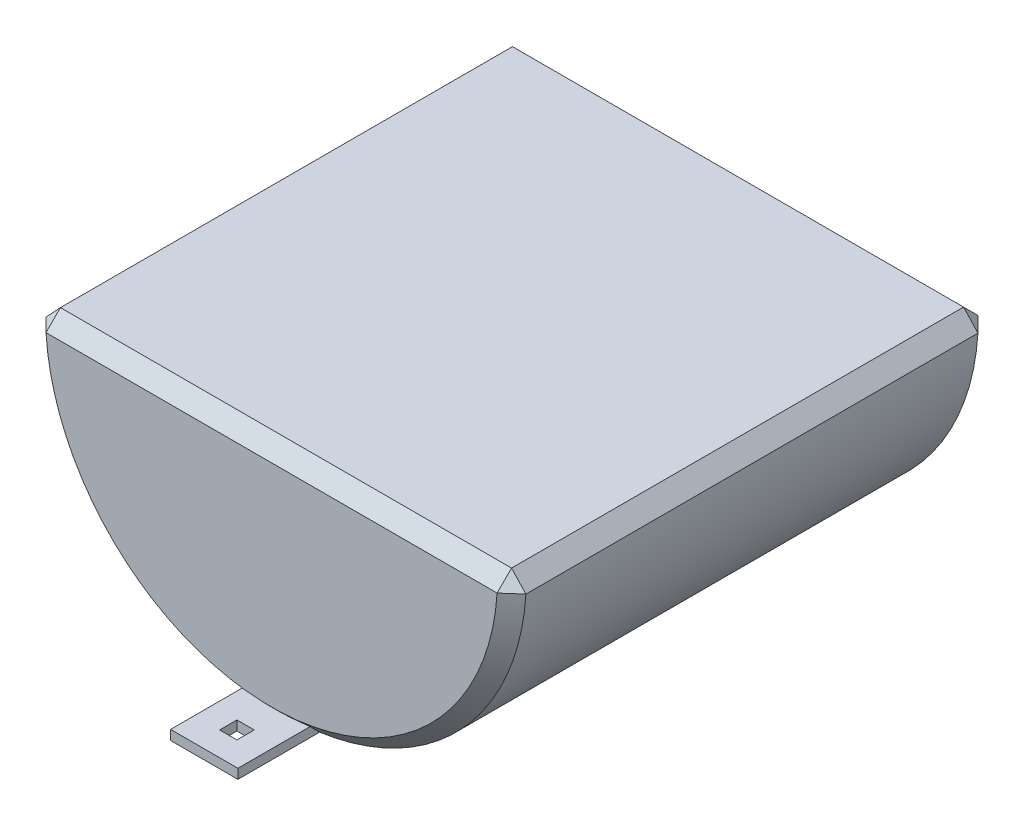
ISO-10303-21;
HEADER;
FILE_DESCRIPTION(('STEP AP214'),'2;1');
FILE_NAME('part.step','',(''),(''),'','','');
FILE_SCHEMA(('AUTOMOTIVE_DESIGN { 1 0 10303 214 1 1 1 1 }'));
ENDSEC;
DATA;
#1=APPLICATION_CONTEXT('core data for automotive mechanical design processes');
#2=APPLICATION_PROTOCOL_DEFINITION('international standard','automotive_design',2000,#1);
#3=PRODUCT_CONTEXT('',#1,'mechanical');
#4=PRODUCT('Part','Part','',(#3));
#5=PRODUCT_RELATED_PRODUCT_CATEGORY('part','',(#4));
#6=PRODUCT_DEFINITION_FORMATION('','',#4);
#7=PRODUCT_DEFINITION_CONTEXT('part definition',#1,'design');
#8=PRODUCT_DEFINITION('design','',#6,#7);
#9=PRODUCT_DEFINITION_SHAPE('','',#8);
#10=(LENGTH_UNIT() NAMED_UNIT(*) SI_UNIT(.MILLI.,.METRE.));
#11=(NAMED_UNIT(*) PLANE_ANGLE_UNIT() SI_UNIT($,.RADIAN.));
#12=(NAMED_UNIT(*) SI_UNIT($,.STERADIAN.) SOLID_ANGLE_UNIT());
#13=UNCERTAINTY_MEASURE_WITH_UNIT(LENGTH_MEASURE(1.E-05),#10,'distance_accuracy_value','');
#14=(GEOMETRIC_REPRESENTATION_CONTEXT(3) GLOBAL_UNCERTAINTY_ASSIGNED_CONTEXT((#13)) GLOBAL_UNIT_ASSIGNED_CONTEXT((#10,
#11,#12)) REPRESENTATION_CONTEXT('',''));
#15=CARTESIAN_POINT('',(0.,0.,0.));
#16=DIRECTION('',(0.,0.,1.));
#17=DIRECTION('',(1.,0.,0.));
#18=AXIS2_PLACEMENT_3D('',#15,#16,#17);
#19=CARTESIAN_POINT('',(25.,25.,50.));
#20=DIRECTION('',(0.,0.,-1.));
#21=DIRECTION('',(-1.,0.,0.));
#22=AXIS2_PLACEMENT_3D('',#19,#20,#21);
#23=CONICAL_SURFACE('',#22,23.5,0.785398163397452);
#24=CARTESIAN_POINT('',(21.5,2.94269200632307,51.1667325290739));
#25=CARTESIAN_POINT('',(21.5,2.52969256143822,50.7588335212439));
#26=CARTESIAN_POINT('',(21.5,2.11683100339902,50.3507949498407));
#27=CARTESIAN_POINT('',(21.5,1.29134808227903,49.5344751229693));
#28=CARTESIAN_POINT('',(21.5,0.878726719135952,49.1261938675641));
#29=CARTESIAN_POINT('',(21.5,0.0536884240672885,48.3094249330408));
#30=CARTESIAN_POINT('',(21.5,-0.358728507872784,47.9009372539373));
#31=CARTESIAN_POINT('',(21.5,-1.18338449852477,47.0837821723302));
#32=CARTESIAN_POINT('',(21.5,-1.5956235571906,46.6751147697802));
#33=CARTESIAN_POINT('',(21.5,-2.00778683680805,46.2663709758971));
#34=B_SPLINE_CURVE_WITH_KNOTS('',3,(#24,#25,#26,#27,#28,#29,#30,#31,#32,#33),.UNSPECIFIED.,.F.,
.F.,(4,2,2,2,4),(0.,1.74142211894048,3.48284378613279,5.22426532993233,6.96568732463627),.UNSPECIFIED.);
#35=CARTESIAN_POINT('',(21.5,1.24621241102687,49.4897433411874));
#36=VERTEX_POINT('',#35);
#37=CARTESIAN_POINT('',(21.5,0.246212411026864,48.5));
#38=VERTEX_POINT('',#37);
#39=EDGE_CURVE('E11',#36,#38,#34,.T.);
#40=ORIENTED_EDGE('',*,*,#39,.F.);
#41=CARTESIAN_POINT('',(13.0308933330387,1.24621241102687,46.9010913903004));
#42=CARTESIAN_POINT('',(13.401458624964,1.24621241102687,47.0678288544283));
#43=CARTESIAN_POINT('',(13.7743252882683,1.24621241102687,47.2294491204987));
#44=CARTESIAN_POINT('',(14.5249023020002,1.24621241102687,47.5413136423069));
#45=CARTESIAN_POINT('',(14.9026139799392,1.24621241102687,47.6915546988244));
#46=CARTESIAN_POINT('',(16.0450219330295,1.24621241102687,48.1241003478931));
#47=CARTESIAN_POINT('',(16.8170842701124,1.24621241102687,48.3873563626032));
#48=CARTESIAN_POINT('',(18.3728672231256,1.24621241102687,48.8501359501833));
#49=CARTESIAN_POINT('',(19.1564204359001,1.24621241102687,49.05021165646));
#50=CARTESIAN_POINT('',(20.3423091295269,1.24621241102687,49.2969655587769));
#51=CARTESIAN_POINT('',(20.7391880572026,1.24621241102687,49.3703030135917));
#52=CARTESIAN_POINT('',(21.5359463897745,1.24621241102687,49.4981766790939));
#53=CARTESIAN_POINT('',(21.9358255488293,1.24621241102687,49.5527144134194));
#54=CARTESIAN_POINT('',(22.9245031294916,1.24621241102687,49.6628552612914));
#55=CARTESIAN_POINT('',(23.5146074758049,1.24621241102687,49.707140288255));
#56=CARTESIAN_POINT('',(24.6965365463653,1.24621241102687,49.7516175637132));
#57=CARTESIAN_POINT('',(25.2883614722613,1.24621241102687,49.7518044169544));
#58=CARTESIAN_POINT('',(26.4714711521758,1.24621241102687,49.7080366765752));
#59=CARTESIAN_POINT('',(27.0627528275719,1.24621241102687,49.6639995546551));
#60=CARTESIAN_POINT('',(28.2404836497035,1.24621241102687,49.5333434435275));
#61=CARTESIAN_POINT('',(28.8269333623517,1.24621241102687,49.4467295150584));
#62=CARTESIAN_POINT('',(29.8658456650485,1.24621241102687,49.2571140135586));
#63=CARTESIAN_POINT('',(30.3197303568505,1.24621241102687,49.1617640215412));
#64=CARTESIAN_POINT('',(31.2222386632148,1.24621241102687,48.9486997959963));
#65=CARTESIAN_POINT('',(31.6708615649582,1.24621241102687,48.8309825686813));
#66=CARTESIAN_POINT('',(33.0092044481385,1.24621241102687,48.4468799365095));
#67=CARTESIAN_POINT('',(33.8902414668686,1.24621241102687,48.1497638941563));
#68=CARTESIAN_POINT('',(35.1931327969802,1.24621241102687,47.6546829406354));
#69=CARTESIAN_POINT('',(35.6246778873749,1.24621241102687,47.4812530711538));
#70=CARTESIAN_POINT('',(36.4816533648986,1.24621241102687,47.1197051366759));
#71=CARTESIAN_POINT('',(36.907083245347,1.24621241102687,46.9315858627897));
#72=CARTESIAN_POINT('',(37.7503122889009,1.24621241102687,46.5431224255061));
#73=CARTESIAN_POINT('',(38.1681344315218,1.24621241102687,46.3428278256129));
#74=CARTESIAN_POINT('',(38.9979898943832,1.24621241102687,45.9308712770064));
#75=CARTESIAN_POINT('',(39.4100248918529,1.24621241102687,45.719212711294));
#76=CARTESIAN_POINT('',(39.819379179539,1.24621241102687,45.5025639729456));
#77=B_SPLINE_CURVE_WITH_KNOTS('',3,(#41,#42,#43,#44,#45,#46,#47,#48,#49,#50,#51,#52,#53,#54,#55,
#56,#57,#58,#59,#60,#61,#62,#63,#64,#65,#66,#67,#68,#69,#70,#71,#72,#73,#74,#75,#76),
.UNSPECIFIED.,.F.,.F.,(4,2,2,2,2,2,2,2,2,2,2,2,2,2,2,2,2,4),(0.,1.21898873462397,
2.43831892070092,4.88325681248539,7.30619585118697,8.51659965829408,9.72690534419579,
11.5005164145858,13.2743444798141,15.0514889260364,16.8284221894509,18.2192049111912,
19.6101739163421,22.395631723907,23.7907331730833,25.1859495558034,26.5758240286496,
27.9652870119271),.UNSPECIFIED.);
#78=CARTESIAN_POINT('',(28.5,1.24621241102687,49.4897433411874));
#79=VERTEX_POINT('',#78);
#80=EDGE_CURVE('E47',#79,#36,#77,.F.);
#81=ORIENTED_EDGE('',*,*,#80,.F.);
#82=CARTESIAN_POINT('',(28.5,-2.00778683680805,46.2663709758971));
#83=CARTESIAN_POINT('',(28.5,-1.5956235571906,46.6751147697802));
#84=CARTESIAN_POINT('',(28.5,-1.18338449852477,47.0837821723302));
#85=CARTESIAN_POINT('',(28.5,-0.358728507872784,47.9009372539372));
#86=CARTESIAN_POINT('',(28.5,0.0536884240672884,48.3094249330408));
#87=CARTESIAN_POINT('',(28.5,0.878726719135952,49.1261938675641));
#88=CARTESIAN_POINT('',(28.5,1.29134808227903,49.5344751229693));
#89=CARTESIAN_POINT('',(28.5,2.11683100339902,50.3507949498407));
#90=CARTESIAN_POINT('',(28.5,2.52969256143822,50.7588335212439));
#91=CARTESIAN_POINT('',(28.5,2.94269200632307,51.1667325290739));
#92=B_SPLINE_CURVE_WITH_KNOTS('',3,(#82,#83,#84,#85,#86,#87,#88,#89,#90,#91),.UNSPECIFIED.,.F.,
.F.,(4,2,2,2,4),(0.,1.74142199470394,3.48284353850347,5.22426520569579,6.96568732463627),.UNSPECIFIED.);
#93=CARTESIAN_POINT('',(28.5,0.246212411026871,48.5));
#94=VERTEX_POINT('',#93);
#95=EDGE_CURVE('E264',#94,#79,#92,.T.);
#96=ORIENTED_EDGE('',*,*,#95,.F.);
#97=CARTESIAN_POINT('',(25.,25.,48.5));
#98=DIRECTION('',(0.,0.,1.));
#99=DIRECTION('',(1.,0.,0.));
#100=AXIS2_PLACEMENT_3D('',#97,#98,#99);
#101=CIRCLE('',#100,25.);
#102=CARTESIAN_POINT('',(49.9490199990608,23.404255319149,48.5));
#103=VERTEX_POINT('',#102);
#104=EDGE_CURVE('E221',#103,#94,#101,.F.);
#105=ORIENTED_EDGE('',*,*,#104,.F.);
#106=DIRECTION('',(0.70566484901179,-0.0451344753948861,-0.707106781186545));
#107=VECTOR('',#106,1.);
#108=CARTESIAN_POINT('',(25.,25.,73.4999999999998));
#109=LINE('',#108,#107);
#110=CARTESIAN_POINT('',(48.4520787991172,23.5,50.));
#111=VERTEX_POINT('',#110);
#112=EDGE_CURVE('E199',#111,#103,#109,.T.);
#113=ORIENTED_EDGE('',*,*,#112,.F.);
#114=CARTESIAN_POINT('',(25.,25.,50.));
#115=DIRECTION('',(0.,0.,1.));
#116=DIRECTION('',(1.,0.,0.));
#117=AXIS2_PLACEMENT_3D('',#114,#115,#116);
#118=CIRCLE('',#117,23.5);
#119=CARTESIAN_POINT('',(1.54792120088284,23.5,50.));
#120=VERTEX_POINT('',#119);
#121=EDGE_CURVE('E211',#120,#111,#118,.T.);
#122=ORIENTED_EDGE('',*,*,#121,.F.);
#123=DIRECTION('',(0.705664849011789,0.0451344753948857,0.707106781186545));
#124=VECTOR('',#123,1.);
#125=CARTESIAN_POINT('',(25.,25.,73.4999999999998));
#126=LINE('',#125,#124);
#127=CARTESIAN_POINT('',(0.0509800009392017,23.4042553191489,48.5));
#128=VERTEX_POINT('',#127);
#129=EDGE_CURVE('E248',#128,#120,#126,.T.);
#130=ORIENTED_EDGE('',*,*,#129,.F.);
#131=EDGE_CURVE('E220',#38,#128,#101,.F.);
#132=ORIENTED_EDGE('',*,*,#131,.F.);
#133=EDGE_LOOP('',(#40,#81,#96,#105,#113,#122,#130,#132));
#134=FACE_BOUND('',#133,.T.);
#135=ADVANCED_FACE('F35',(#134),#23,.T.);
#136=CARTESIAN_POINT('',(25.,25.,50.));
#137=DIRECTION('',(0.,0.,-1.));
#138=DIRECTION('',(-1.,0.,0.));
#139=AXIS2_PLACEMENT_3D('',#136,#137,#138);
#140=CYLINDRICAL_SURFACE('',#139,25.);
#141=ORIENTED_EDGE('',*,*,#104,.T.);
#142=EDGE_CURVE('E224',#94,#38,#101,.F.);
#143=ORIENTED_EDGE('',*,*,#142,.T.);
#144=ORIENTED_EDGE('',*,*,#131,.T.);
#145=DIRECTION('',(0.,0.,-1.));
#146=VECTOR('',#145,1.);
#147=CARTESIAN_POINT('',(0.0509800009392061,23.4042553191489,50.));
#148=LINE('',#147,#146);
#149=CARTESIAN_POINT('',(0.0509800009392017,23.4042553191489,1.49999999999999));
#150=VERTEX_POINT('',#149);
#151=EDGE_CURVE('E223',#128,#150,#148,.T.);
#152=ORIENTED_EDGE('',*,*,#151,.T.);
#153=CARTESIAN_POINT('',(25.,25.,1.49999999999999));
#154=DIRECTION('',(0.,0.,1.));
#155=DIRECTION('',(1.,0.,0.));
#156=AXIS2_PLACEMENT_3D('',#153,#154,#155);
#157=CIRCLE('',#156,25.);
#158=CARTESIAN_POINT('',(49.9490199990608,23.404255319149,1.49999999999999));
#159=VERTEX_POINT('',#158);
#160=EDGE_CURVE('E216',#150,#159,#157,.T.);
#161=ORIENTED_EDGE('',*,*,#160,.T.);
#162=DIRECTION('',(0.,0.,-1.));
#163=VECTOR('',#162,1.);
#164=CARTESIAN_POINT('',(49.9490199990608,23.404255319149,50.));
#165=LINE('',#164,#163);
#166=EDGE_CURVE('E218',#159,#103,#165,.F.);
#167=ORIENTED_EDGE('',*,*,#166,.T.);
#168=EDGE_LOOP('',(#141,#143,#144,#152,#161,#167));
#169=FACE_BOUND('',#168,.T.);
#170=ADVANCED_FACE('F296',(#169),#140,.T.);
#171=CARTESIAN_POINT('',(0.,25.,50.));
#172=DIRECTION('',(0.,-1.,0.));
#173=DIRECTION('',(0.,0.,-1.));
#174=AXIS2_PLACEMENT_3D('',#171,#172,#173);
#175=PLANE('',#174);
#176=DIRECTION('',(-1.,0.,0.));
#177=VECTOR('',#176,1.);
#178=CARTESIAN_POINT('',(0.,25.,1.49999999999999));
#179=LINE('',#178,#177);
#180=CARTESIAN_POINT('',(48.4520787991172,25.,1.49999999999999));
#181=VERTEX_POINT('',#180);
#182=CARTESIAN_POINT('',(1.54792120088285,25.,1.49999999999999));
#183=VERTEX_POINT('',#182);
#184=EDGE_CURVE('E201',#181,#183,#179,.T.);
#185=ORIENTED_EDGE('',*,*,#184,.T.);
#186=DIRECTION('',(0.,0.,1.));
#187=VECTOR('',#186,1.);
#188=CARTESIAN_POINT('',(1.54792120088285,25.,50.));
#189=LINE('',#188,#187);
#190=CARTESIAN_POINT('',(1.54792120088285,25.,48.5));
#191=VERTEX_POINT('',#190);
#192=EDGE_CURVE('E204',#183,#191,#189,.T.);
#193=ORIENTED_EDGE('',*,*,#192,.T.);
#194=DIRECTION('',(1.,0.,0.));
#195=VECTOR('',#194,1.);
#196=CARTESIAN_POINT('',(50.,25.,48.5));
#197=LINE('',#196,#195);
#198=CARTESIAN_POINT('',(48.4520787991172,25.,48.5));
#199=VERTEX_POINT('',#198);
#200=EDGE_CURVE('E198',#191,#199,#197,.T.);
#201=ORIENTED_EDGE('',*,*,#200,.T.);
#202=DIRECTION('',(0.,0.,-1.));
#203=VECTOR('',#202,1.);
#204=CARTESIAN_POINT('',(48.4520787991172,25.,50.));
#205=LINE('',#204,#203);
#206=EDGE_CURVE('E196',#199,#181,#205,.T.);
#207=ORIENTED_EDGE('',*,*,#206,.T.);
#208=EDGE_LOOP('',(#185,#193,#201,#207));
#209=FACE_BOUND('',#208,.T.);
#210=ADVANCED_FACE('F289',(#209),#175,.F.);
#211=CARTESIAN_POINT('',(25.,25.,50.));
#212=DIRECTION('',(0.,0.,1.));
#213=DIRECTION('',(1.,0.,0.));
#214=AXIS2_PLACEMENT_3D('',#211,#212,#213);
#215=PLANE('',#214);
#216=ORIENTED_EDGE('',*,*,#121,.T.);
#217=DIRECTION('',(-1.,0.,0.));
#218=VECTOR('',#217,1.);
#219=CARTESIAN_POINT('',(0.,23.5,50.));
#220=LINE('',#219,#218);
#221=EDGE_CURVE('E213',#111,#120,#220,.T.);
#222=ORIENTED_EDGE('',*,*,#221,.T.);
#223=EDGE_LOOP('',(#216,#222));
#224=FACE_BOUND('',#223,.T.);
#225=ADVANCED_FACE('F285',(#224),#215,.T.);
#226=CARTESIAN_POINT('',(25.,25.,0.));
#227=DIRECTION('',(0.,0.,1.));
#228=DIRECTION('',(1.,0.,0.));
#229=AXIS2_PLACEMENT_3D('',#226,#227,#228);
#230=PLANE('',#229);
#231=CARTESIAN_POINT('',(25.,25.,0.));
#232=DIRECTION('',(0.,0.,1.));
#233=DIRECTION('',(1.,0.,0.));
#234=AXIS2_PLACEMENT_3D('',#231,#232,#233);
#235=CIRCLE('',#234,23.5);
#236=CARTESIAN_POINT('',(48.4520787991172,23.5,0.));
#237=VERTEX_POINT('',#236);
#238=CARTESIAN_POINT('',(1.54792120088285,23.5,0.));
#239=VERTEX_POINT('',#238);
#240=EDGE_CURVE('E206',#237,#239,#235,.F.);
#241=ORIENTED_EDGE('',*,*,#240,.T.);
#242=DIRECTION('',(1.,0.,0.));
#243=VECTOR('',#242,1.);
#244=CARTESIAN_POINT('',(25.,23.5,0.));
#245=LINE('',#244,#243);
#246=EDGE_CURVE('E208',#239,#237,#245,.T.);
#247=ORIENTED_EDGE('',*,*,#246,.T.);
#248=EDGE_LOOP('',(#241,#247));
#249=FACE_BOUND('',#248,.T.);
#250=ADVANCED_FACE('F288',(#249),#230,.F.);
#251=CARTESIAN_POINT('',(25.,23.5,50.));
#252=DIRECTION('',(0.,0.70710678118655,0.707106781186545));
#253=DIRECTION('',(1.,0.,0.));
#254=AXIS2_PLACEMENT_3D('',#251,#252,#253);
#255=PLANE('',#254);
#256=DIRECTION('',(0.,0.707106781186545,-0.70710678118655));
#257=VECTOR('',#256,1.);
#258=CARTESIAN_POINT('',(1.54792120088285,23.5,50.));
#259=LINE('',#258,#257);
#260=EDGE_CURVE('E250',#120,#191,#259,.T.);
#261=ORIENTED_EDGE('',*,*,#260,.F.);
#262=ORIENTED_EDGE('',*,*,#221,.F.);
#263=DIRECTION('',(0.,-0.707106781186545,0.70710678118655));
#264=VECTOR('',#263,1.);
#265=CARTESIAN_POINT('',(48.4520787991172,25.,48.5));
#266=LINE('',#265,#264);
#267=EDGE_CURVE('E253',#199,#111,#266,.T.);
#268=ORIENTED_EDGE('',*,*,#267,.F.);
#269=ORIENTED_EDGE('',*,*,#200,.F.);
#270=EDGE_LOOP('',(#261,#262,#268,#269));
#271=FACE_BOUND('',#270,.T.);
#272=ADVANCED_FACE('F37',(#271),#255,.T.);
#273=CARTESIAN_POINT('',(12.8270747485074,0.246212411026871,45.9150383509706));
#274=CARTESIAN_POINT('',(13.2104738803817,0.246212411026871,46.0842117831991));
#275=CARTESIAN_POINT('',(13.5962149146561,0.246212411026871,46.2480125763005));
#276=CARTESIAN_POINT('',(14.3726438319937,0.246212411026871,46.563693625229));
#277=CARTESIAN_POINT('',(14.7633328612493,0.246212411026871,46.7155710581319));
#278=CARTESIAN_POINT('',(15.9449082299162,0.246212411026871,47.1521641031752));
#279=CARTESIAN_POINT('',(16.743388471569,0.246212411026871,47.4169826599547));
#280=CARTESIAN_POINT('',(17.950959795929,0.246212411026871,47.7649622663728));
#281=CARTESIAN_POINT('',(18.3531791673422,0.246212411026871,47.8723495180146));
#282=CARTESIAN_POINT('',(19.1617814088737,0.246212411026871,48.0700730874415));
#283=CARTESIAN_POINT('',(19.5681638417842,0.246212411026871,48.1604111767746));
#284=CARTESIAN_POINT('',(20.3841678276222,0.246212411026871,48.3227041362204));
#285=CARTESIAN_POINT('',(20.7937856618243,0.246212411026871,48.3946776275353));
#286=CARTESIAN_POINT('',(21.6159172878124,0.246212411026871,48.5192703287686));
#287=CARTESIAN_POINT('',(22.0284308532528,0.246212411026871,48.571891034607));
#288=CARTESIAN_POINT('',(23.0542718841478,0.246212411026871,48.6773189656727));
#289=CARTESIAN_POINT('',(23.6688883037512,0.246212411026871,48.7180768071933));
#290=CARTESIAN_POINT('',(24.8995054857107,0.246212411026871,48.7536535247533));
#291=CARTESIAN_POINT('',(25.5155064098334,0.246212411026871,48.7484667201943));
#292=CARTESIAN_POINT('',(26.7467936769364,0.246212411026871,48.6922960012769));
#293=CARTESIAN_POINT('',(27.3620752596175,0.246212411026871,48.6412086242483));
#294=CARTESIAN_POINT('',(28.5872738122456,0.246212411026871,48.4950294399408));
#295=CARTESIAN_POINT('',(29.1971914092921,0.246212411026871,48.3999428481805));
#296=CARTESIAN_POINT('',(30.2844250754775,0.246212411026871,48.1928533027115));
#297=CARTESIAN_POINT('',(30.7631982647934,0.246212411026871,48.0883590203593));
#298=CARTESIAN_POINT('',(31.714992700637,0.246212411026871,47.8557377972395));
#299=CARTESIAN_POINT('',(32.188013491391,0.246212411026871,47.7276089967004));
#300=CARTESIAN_POINT('',(33.1283571039844,0.246212411026871,47.4497009186612));
#301=CARTESIAN_POINT('',(33.5956707276168,0.246212411026871,47.2998906931645));
#302=CARTESIAN_POINT('',(34.5237272482445,0.246212411026871,46.9809232073965));
#303=CARTESIAN_POINT('',(34.9844687729029,0.246212411026871,46.8117619710266));
#304=CARTESIAN_POINT('',(35.8986396817161,0.246212411026871,46.4564576889811));
#305=CARTESIAN_POINT('',(36.3520778037944,0.246212411026871,46.270337036301));
#306=CARTESIAN_POINT('',(37.2524632813226,0.246212411026871,45.8828366212469));
#307=CARTESIAN_POINT('',(37.6994094469282,0.246212411026871,45.6814541027054));
#308=CARTESIAN_POINT('',(38.5866959735899,0.246212411026871,45.2653627738034));
#309=CARTESIAN_POINT('',(39.0270402221643,0.246212411026871,45.0506622218213));
#310=CARTESIAN_POINT('',(39.9015573646541,0.246212411026871,44.6094410399912));
#311=CARTESIAN_POINT('',(40.3357326137644,0.246212411026871,44.3829250841965));
#312=CARTESIAN_POINT('',(40.7670731600567,0.246212411026871,44.1512249653486));
#313=B_SPLINE_CURVE_WITH_KNOTS('',3,(#273,#274,#275,#276,#277,#278,#279,#280,#281,#282,#283,
#284,#285,#286,#287,#288,#289,#290,#291,#292,#293,#294,#295,#296,#297,#298,#299,#300,#301,#302,
#303,#304,#305,#306,#307,#308,#309,#310,#311,#312),.UNSPECIFIED.,.F.,.F.,(4,2,2,2,2,2,2,2,2,2,2,
2,2,2,2,2,2,2,2,4),(0.,1.2570777703592,2.51445226915072,5.03548391961362,6.28411541209428,
7.53261708999935,8.77984774487294,10.0269819717819,11.8731147392722,13.7194757659015,
15.570009072078,17.4203230784423,18.8898417759899,20.359476157541,21.8312293675619,
23.303285527249,24.7734254148011,26.2438314331133,27.7133346096904,29.182260810534),.UNSPECIFIED.);
#314=EDGE_CURVE('E227',#38,#94,#313,.T.);
#315=ORIENTED_EDGE('',*,*,#314,.F.);
#316=ORIENTED_EDGE('',*,*,#142,.F.);
#317=EDGE_LOOP('',(#315,#316));
#318=FACE_BOUND('',#317,.T.);
#319=ADVANCED_FACE('F269',(#318),#23,.T.);
#320=CARTESIAN_POINT('',(48.4520787991172,25.,48.5));
#321=DIRECTION('',(0.601929265428843,0.564659702573284,0.56465970257328));
#322=DIRECTION('',(-0.68416745492824,0.729324957489468,0.));
#323=AXIS2_PLACEMENT_3D('',#320,#321,#322);
#324=PLANE('',#323);
#325=ORIENTED_EDGE('',*,*,#267,.T.);
#326=ORIENTED_EDGE('',*,*,#112,.T.);
#327=DIRECTION('',(0.684167454928237,-0.729324957489471,0.));
#328=VECTOR('',#327,1.);
#329=CARTESIAN_POINT('',(48.4520787991172,25.,48.5));
#330=LINE('',#329,#328);
#331=EDGE_CURVE('E245',#199,#103,#330,.T.);
#332=ORIENTED_EDGE('',*,*,#331,.F.);
#333=EDGE_LOOP('',(#325,#326,#332));
#334=FACE_BOUND('',#333,.T.);
#335=ADVANCED_FACE('F326',(#334),#324,.T.);
#336=CARTESIAN_POINT('',(1.54792120088285,23.5,50.));
#337=DIRECTION('',(-0.601929265428843,0.564659702573283,0.56465970257328));
#338=DIRECTION('',(-0.684167454928239,-0.729324957489469,0.));
#339=AXIS2_PLACEMENT_3D('',#336,#337,#338);
#340=PLANE('',#339);
#341=ORIENTED_EDGE('',*,*,#129,.T.);
#342=ORIENTED_EDGE('',*,*,#260,.T.);
#343=DIRECTION('',(0.684167454928236,0.729324957489472,0.));
#344=VECTOR('',#343,1.);
#345=CARTESIAN_POINT('',(0.79945060091102,24.2021276595745,48.5));
#346=LINE('',#345,#344);
#347=EDGE_CURVE('E242',#128,#191,#346,.T.);
#348=ORIENTED_EDGE('',*,*,#347,.F.);
#349=EDGE_LOOP('',(#341,#342,#348));
#350=FACE_BOUND('',#349,.T.);
#351=ADVANCED_FACE('F323',(#350),#340,.T.);
#352=CARTESIAN_POINT('',(48.4520787991172,25.,50.));
#353=DIRECTION('',(-0.729324957489471,-0.684167454928237,0.));
#354=DIRECTION('',(0.,0.,-1.));
#355=AXIS2_PLACEMENT_3D('',#352,#353,#354);
#356=PLANE('',#355);
#357=ORIENTED_EDGE('',*,*,#331,.T.);
#358=ORIENTED_EDGE('',*,*,#166,.F.);
#359=DIRECTION('',(-0.684167454928237,0.729324957489471,0.));
#360=VECTOR('',#359,1.);
#361=CARTESIAN_POINT('',(49.200549399089,24.2021276595745,1.49999999999999));
#362=LINE('',#361,#360);
#363=EDGE_CURVE('E236',#181,#159,#362,.F.);
#364=ORIENTED_EDGE('',*,*,#363,.F.);
#365=ORIENTED_EDGE('',*,*,#206,.F.);
#366=EDGE_LOOP('',(#357,#358,#364,#365));
#367=FACE_BOUND('',#366,.T.);
#368=ADVANCED_FACE('F319',(#367),#356,.F.);
#369=CARTESIAN_POINT('',(0.0509800009392027,23.4042553191489,50.));
#370=DIRECTION('',(0.729324957489472,-0.684167454928236,0.));
#371=DIRECTION('',(0.,0.,-1.));
#372=AXIS2_PLACEMENT_3D('',#369,#370,#371);
#373=PLANE('',#372);
#374=ORIENTED_EDGE('',*,*,#347,.T.);
#375=ORIENTED_EDGE('',*,*,#192,.F.);
#376=DIRECTION('',(-0.684167454928236,-0.729324957489472,0.));
#377=VECTOR('',#376,1.);
#378=CARTESIAN_POINT('',(1.54792120088285,25.,1.49999999999999));
#379=LINE('',#378,#377);
#380=EDGE_CURVE('E233',#150,#183,#379,.F.);
#381=ORIENTED_EDGE('',*,*,#380,.F.);
#382=ORIENTED_EDGE('',*,*,#151,.F.);
#383=EDGE_LOOP('',(#374,#375,#381,#382));
#384=FACE_BOUND('',#383,.T.);
#385=ADVANCED_FACE('F315',(#384),#373,.F.);
#386=CARTESIAN_POINT('',(25.,25.,1.49999999999999));
#387=DIRECTION('',(0.,0.,1.));
#388=DIRECTION('',(1.,0.,0.));
#389=AXIS2_PLACEMENT_3D('',#386,#387,#388);
#390=CONICAL_SURFACE('',#389,25.,0.785398163397452);
#391=DIRECTION('',(-0.70566484901179,0.0451344753948796,-0.707106781186545));
#392=VECTOR('',#391,1.);
#393=CARTESIAN_POINT('',(24.9999999999999,24.9999999999999,-23.4999999999998));
#394=LINE('',#393,#392);
#395=EDGE_CURVE('E239',#159,#237,#394,.T.);
#396=ORIENTED_EDGE('',*,*,#395,.F.);
#397=ORIENTED_EDGE('',*,*,#160,.F.);
#398=DIRECTION('',(-0.70566484901179,-0.0451344753948827,0.707106781186545));
#399=VECTOR('',#398,1.);
#400=CARTESIAN_POINT('',(25.,25.,-23.4999999999998));
#401=LINE('',#400,#399);
#402=EDGE_CURVE('E231',#239,#150,#401,.T.);
#403=ORIENTED_EDGE('',*,*,#402,.F.);
#404=ORIENTED_EDGE('',*,*,#240,.F.);
#405=EDGE_LOOP('',(#396,#397,#403,#404));
#406=FACE_BOUND('',#405,.T.);
#407=ADVANCED_FACE('F311',(#406),#390,.T.);
#408=CARTESIAN_POINT('',(48.4520787991172,23.5,0.));
#409=DIRECTION('',(0.601929265428842,0.564659702573278,-0.564659702573285));
#410=DIRECTION('',(-0.684167454928241,0.,-0.729324957489467));
#411=AXIS2_PLACEMENT_3D('',#408,#409,#410);
#412=PLANE('',#411);
#413=ORIENTED_EDGE('',*,*,#363,.T.);
#414=ORIENTED_EDGE('',*,*,#395,.T.);
#415=DIRECTION('',(0.,-0.70710678118655,-0.707106781186545));
#416=VECTOR('',#415,1.);
#417=CARTESIAN_POINT('',(48.4520787991172,23.5,0.));
#418=LINE('',#417,#416);
#419=EDGE_CURVE('E229',#181,#237,#418,.T.);
#420=ORIENTED_EDGE('',*,*,#419,.F.);
#421=EDGE_LOOP('',(#413,#414,#420));
#422=FACE_BOUND('',#421,.T.);
#423=ADVANCED_FACE('F307',(#422),#412,.T.);
#424=CARTESIAN_POINT('',(1.54792120088285,25.,1.49999999999999));
#425=DIRECTION('',(-0.601929265428843,0.564659702573279,-0.564659702573284));
#426=DIRECTION('',(-0.684167454928239,0.,0.729324957489469));
#427=AXIS2_PLACEMENT_3D('',#424,#425,#426);
#428=PLANE('',#427);
#429=ORIENTED_EDGE('',*,*,#402,.T.);
#430=ORIENTED_EDGE('',*,*,#380,.T.);
#431=DIRECTION('',(0.,0.70710678118655,0.707106781186545));
#432=VECTOR('',#431,1.);
#433=CARTESIAN_POINT('',(1.54792120088285,25.,1.49999999999999));
#434=LINE('',#433,#432);
#435=EDGE_CURVE('E190',#239,#183,#434,.T.);
#436=ORIENTED_EDGE('',*,*,#435,.F.);
#437=EDGE_LOOP('',(#429,#430,#436));
#438=FACE_BOUND('',#437,.T.);
#439=ADVANCED_FACE('F303',(#438),#428,.T.);
#440=CARTESIAN_POINT('',(0.,25.,1.49999999999999));
#441=DIRECTION('',(0.,-0.707106781186545,0.70710678118655));
#442=DIRECTION('',(-1.,0.,0.));
#443=AXIS2_PLACEMENT_3D('',#440,#441,#442);
#444=PLANE('',#443);
#445=ORIENTED_EDGE('',*,*,#419,.T.);
#446=ORIENTED_EDGE('',*,*,#246,.F.);
#447=ORIENTED_EDGE('',*,*,#435,.T.);
#448=ORIENTED_EDGE('',*,*,#184,.F.);
#449=EDGE_LOOP('',(#445,#446,#447,#448));
#450=FACE_BOUND('',#449,.T.);
#451=ADVANCED_FACE('F283',(#450),#444,.F.);
#452=CARTESIAN_POINT('',(21.5,0.246212411026871,40.));
#453=DIRECTION('',(-1.,0.,0.));
#454=DIRECTION('',(0.,0.,1.));
#455=AXIS2_PLACEMENT_3D('',#452,#453,#454);
#456=PLANE('',#455);
#457=DIRECTION('',(0.,0.,1.));
#458=VECTOR('',#457,1.);
#459=CARTESIAN_POINT('',(21.5,1.24621241102687,40.));
#460=LINE('',#459,#458);
#461=CARTESIAN_POINT('',(21.5,1.24621241102687,57.));
#462=VERTEX_POINT('',#461);
#463=EDGE_CURVE('E188',#36,#462,#460,.T.);
#464=ORIENTED_EDGE('',*,*,#463,.F.);
#465=ORIENTED_EDGE('',*,*,#39,.T.);
#466=DIRECTION('',(0.,0.,1.));
#467=VECTOR('',#466,1.);
#468=CARTESIAN_POINT('',(21.5,0.246212411026871,40.));
#469=LINE('',#468,#467);
#470=CARTESIAN_POINT('',(21.5,0.246212411026871,57.));
#471=VERTEX_POINT('',#470);
#472=EDGE_CURVE('E187',#38,#471,#469,.T.);
#473=ORIENTED_EDGE('',*,*,#472,.T.);
#474=DIRECTION('',(0.,-1.,0.));
#475=VECTOR('',#474,1.);
#476=CARTESIAN_POINT('',(21.5,0.246212411026871,57.));
#477=LINE('',#476,#475);
#478=EDGE_CURVE('E175',#462,#471,#477,.T.);
#479=ORIENTED_EDGE('',*,*,#478,.F.);
#480=EDGE_LOOP('',(#464,#465,#473,#479));
#481=FACE_BOUND('',#480,.T.);
#482=ADVANCED_FACE('F278',(#481),#456,.T.);
#483=CARTESIAN_POINT('',(21.5,1.24621241102687,40.));
#484=DIRECTION('',(0.,1.,0.));
#485=DIRECTION('',(0.,0.,1.));
#486=AXIS2_PLACEMENT_3D('',#483,#484,#485);
#487=PLANE('',#486);
#488=DIRECTION('',(0.,0.,1.));
#489=VECTOR('',#488,1.);
#490=CARTESIAN_POINT('',(24.1,1.24621241102687,40.));
#491=LINE('',#490,#489);
#492=CARTESIAN_POINT('',(24.1,1.24621241102687,52.7));
#493=VERTEX_POINT('',#492);
#494=CARTESIAN_POINT('',(24.1,1.24621241102687,54.5));
#495=VERTEX_POINT('',#494);
#496=EDGE_CURVE('E173',#493,#495,#491,.T.);
#497=ORIENTED_EDGE('',*,*,#496,.F.);
#498=DIRECTION('',(-1.,0.,0.));
#499=VECTOR('',#498,1.);
#500=CARTESIAN_POINT('',(21.5,1.24621241102687,52.7));
#501=LINE('',#500,#499);
#502=CARTESIAN_POINT('',(25.9,1.24621241102687,52.7));
#503=VERTEX_POINT('',#502);
#504=EDGE_CURVE('E166',#503,#493,#501,.T.);
#505=ORIENTED_EDGE('',*,*,#504,.F.);
#506=DIRECTION('',(0.,0.,-1.));
#507=VECTOR('',#506,1.);
#508=CARTESIAN_POINT('',(25.9,1.24621241102687,40.));
#509=LINE('',#508,#507);
#510=CARTESIAN_POINT('',(25.9,1.24621241102687,54.5));
#511=VERTEX_POINT('',#510);
#512=EDGE_CURVE('E146',#511,#503,#509,.T.);
#513=ORIENTED_EDGE('',*,*,#512,.F.);
#514=DIRECTION('',(1.,0.,0.));
#515=VECTOR('',#514,1.);
#516=CARTESIAN_POINT('',(21.5000000000001,1.24621241102687,54.5));
#517=LINE('',#516,#515);
#518=EDGE_CURVE('E171',#495,#511,#517,.T.);
#519=ORIENTED_EDGE('',*,*,#518,.F.);
#520=EDGE_LOOP('',(#497,#505,#513,#519));
#521=FACE_BOUND('',#520,.T.);
#522=DIRECTION('',(0.,0.,1.));
#523=VECTOR('',#522,1.);
#524=CARTESIAN_POINT('',(28.5,1.24621241102687,40.));
#525=LINE('',#524,#523);
#526=CARTESIAN_POINT('',(28.5,1.24621241102687,57.));
#527=VERTEX_POINT('',#526);
#528=EDGE_CURVE('E191',#79,#527,#525,.T.);
#529=ORIENTED_EDGE('',*,*,#528,.F.);
#530=ORIENTED_EDGE('',*,*,#80,.T.);
#531=ORIENTED_EDGE('',*,*,#463,.T.);
#532=DIRECTION('',(-1.,0.,0.));
#533=VECTOR('',#532,1.);
#534=CARTESIAN_POINT('',(21.5,1.24621241102687,57.));
#535=LINE('',#534,#533);
#536=EDGE_CURVE('E184',#527,#462,#535,.T.);
#537=ORIENTED_EDGE('',*,*,#536,.F.);
#538=EDGE_LOOP('',(#529,#530,#531,#537));
#539=FACE_BOUND('',#538,.T.);
#540=ADVANCED_FACE('F282',(#521,#539),#487,.T.);
#541=CARTESIAN_POINT('',(28.5,0.246212411026871,40.));
#542=DIRECTION('',(1.,0.,0.));
#543=DIRECTION('',(0.,0.,-1.));
#544=AXIS2_PLACEMENT_3D('',#541,#542,#543);
#545=PLANE('',#544);
#546=DIRECTION('',(0.,0.,1.));
#547=VECTOR('',#546,1.);
#548=CARTESIAN_POINT('',(28.5,0.246212411026871,40.));
#549=LINE('',#548,#547);
#550=CARTESIAN_POINT('',(28.5,0.246212411026871,57.));
#551=VERTEX_POINT('',#550);
#552=EDGE_CURVE('E193',#94,#551,#549,.T.);
#553=ORIENTED_EDGE('',*,*,#552,.F.);
#554=ORIENTED_EDGE('',*,*,#95,.T.);
#555=ORIENTED_EDGE('',*,*,#528,.T.);
#556=DIRECTION('',(0.,1.,0.));
#557=VECTOR('',#556,1.);
#558=CARTESIAN_POINT('',(28.5,0.246212411026871,57.));
#559=LINE('',#558,#557);
#560=EDGE_CURVE('E181',#551,#527,#559,.T.);
#561=ORIENTED_EDGE('',*,*,#560,.F.);
#562=EDGE_LOOP('',(#553,#554,#555,#561));
#563=FACE_BOUND('',#562,.T.);
#564=ADVANCED_FACE('F275',(#563),#545,.T.);
#565=CARTESIAN_POINT('',(21.5,0.246212411026871,40.));
#566=DIRECTION('',(0.,-1.,0.));
#567=DIRECTION('',(0.,0.,-1.));
#568=AXIS2_PLACEMENT_3D('',#565,#566,#567);
#569=PLANE('',#568);
#570=DIRECTION('',(0.,0.,-1.));
#571=VECTOR('',#570,1.);
#572=CARTESIAN_POINT('',(24.1,0.246212411026871,54.5));
#573=LINE('',#572,#571);
#574=CARTESIAN_POINT('',(24.1,0.246212411026871,54.5));
#575=VERTEX_POINT('',#574);
#576=CARTESIAN_POINT('',(24.1,0.246212411026871,52.7));
#577=VERTEX_POINT('',#576);
#578=EDGE_CURVE('E62',#575,#577,#573,.T.);
#579=ORIENTED_EDGE('',*,*,#578,.F.);
#580=DIRECTION('',(-1.,0.,0.));
#581=VECTOR('',#580,1.);
#582=CARTESIAN_POINT('',(24.1,0.246212411026871,54.5));
#583=LINE('',#582,#581);
#584=CARTESIAN_POINT('',(25.9,0.246212411026871,54.5));
#585=VERTEX_POINT('',#584);
#586=EDGE_CURVE('E159',#585,#575,#583,.T.);
#587=ORIENTED_EDGE('',*,*,#586,.F.);
#588=DIRECTION('',(0.,0.,1.));
#589=VECTOR('',#588,1.);
#590=CARTESIAN_POINT('',(25.9,0.246212411026871,54.5));
#591=LINE('',#590,#589);
#592=CARTESIAN_POINT('',(25.9,0.246212411026871,52.7));
#593=VERTEX_POINT('',#592);
#594=EDGE_CURVE('E143',#593,#585,#591,.T.);
#595=ORIENTED_EDGE('',*,*,#594,.F.);
#596=DIRECTION('',(1.,0.,0.));
#597=VECTOR('',#596,1.);
#598=CARTESIAN_POINT('',(24.1,0.246212411026871,52.7));
#599=LINE('',#598,#597);
#600=EDGE_CURVE('E152',#577,#593,#599,.T.);
#601=ORIENTED_EDGE('',*,*,#600,.F.);
#602=EDGE_LOOP('',(#579,#587,#595,#601));
#603=FACE_BOUND('',#602,.T.);
#604=ORIENTED_EDGE('',*,*,#472,.F.);
#605=ORIENTED_EDGE('',*,*,#314,.T.);
#606=ORIENTED_EDGE('',*,*,#552,.T.);
#607=DIRECTION('',(1.,0.,0.));
#608=VECTOR('',#607,1.);
#609=CARTESIAN_POINT('',(21.5,0.246212411026871,57.));
#610=LINE('',#609,#608);
#611=EDGE_CURVE('E178',#471,#551,#610,.T.);
#612=ORIENTED_EDGE('',*,*,#611,.F.);
#613=EDGE_LOOP('',(#604,#605,#606,#612));
#614=FACE_BOUND('',#613,.T.);
#615=ADVANCED_FACE('F156',(#603,#614),#569,.T.);
#616=CARTESIAN_POINT('',(0.,0.,57.));
#617=DIRECTION('',(0.,0.,-1.));
#618=DIRECTION('',(-1.,0.,0.));
#619=AXIS2_PLACEMENT_3D('',#616,#617,#618);
#620=PLANE('',#619);
#621=ORIENTED_EDGE('',*,*,#478,.T.);
#622=ORIENTED_EDGE('',*,*,#611,.T.);
#623=ORIENTED_EDGE('',*,*,#560,.T.);
#624=ORIENTED_EDGE('',*,*,#536,.T.);
#625=EDGE_LOOP('',(#621,#622,#623,#624));
#626=FACE_BOUND('',#625,.T.);
#627=ADVANCED_FACE('F274',(#626),#620,.F.);
#628=CARTESIAN_POINT('',(24.1,7.24621241102687,54.5));
#629=DIRECTION('',(-1.,0.,0.));
#630=DIRECTION('',(0.,0.,1.));
#631=AXIS2_PLACEMENT_3D('',#628,#629,#630);
#632=PLANE('',#631);
#633=ORIENTED_EDGE('',*,*,#496,.T.);
#634=DIRECTION('',(0.,-1.,0.));
#635=VECTOR('',#634,1.);
#636=CARTESIAN_POINT('',(24.1,7.24621241102687,54.5));
#637=LINE('',#636,#635);
#638=EDGE_CURVE('E164',#495,#575,#637,.T.);
#639=ORIENTED_EDGE('',*,*,#638,.T.);
#640=ORIENTED_EDGE('',*,*,#578,.T.);
#641=DIRECTION('',(0.,-1.,0.));
#642=VECTOR('',#641,1.);
#643=CARTESIAN_POINT('',(24.1,7.24621241102687,52.7));
#644=LINE('',#643,#642);
#645=EDGE_CURVE('E149',#493,#577,#644,.T.);
#646=ORIENTED_EDGE('',*,*,#645,.F.);
#647=EDGE_LOOP('',(#633,#639,#640,#646));
#648=FACE_BOUND('',#647,.T.);
#649=ADVANCED_FACE('F421',(#648),#632,.F.);
#650=CARTESIAN_POINT('',(24.1,7.24621241102687,54.5));
#651=DIRECTION('',(0.,0.,1.));
#652=DIRECTION('',(1.,0.,0.));
#653=AXIS2_PLACEMENT_3D('',#650,#651,#652);
#654=PLANE('',#653);
#655=ORIENTED_EDGE('',*,*,#518,.T.);
#656=DIRECTION('',(0.,-1.,0.));
#657=VECTOR('',#656,1.);
#658=CARTESIAN_POINT('',(25.9,7.24621241102687,54.5));
#659=LINE('',#658,#657);
#660=EDGE_CURVE('E148',#511,#585,#659,.T.);
#661=ORIENTED_EDGE('',*,*,#660,.T.);
#662=ORIENTED_EDGE('',*,*,#586,.T.);
#663=ORIENTED_EDGE('',*,*,#638,.F.);
#664=EDGE_LOOP('',(#655,#661,#662,#663));
#665=FACE_BOUND('',#664,.T.);
#666=ADVANCED_FACE('F441',(#665),#654,.F.);
#667=CARTESIAN_POINT('',(25.9,7.24621241102687,54.5));
#668=DIRECTION('',(1.,0.,0.));
#669=DIRECTION('',(0.,0.,-1.));
#670=AXIS2_PLACEMENT_3D('',#667,#668,#669);
#671=PLANE('',#670);
#672=ORIENTED_EDGE('',*,*,#512,.T.);
#673=DIRECTION('',(0.,-1.,0.));
#674=VECTOR('',#673,1.);
#675=CARTESIAN_POINT('',(25.9,7.24621241102687,52.7));
#676=LINE('',#675,#674);
#677=EDGE_CURVE('E54',#503,#593,#676,.T.);
#678=ORIENTED_EDGE('',*,*,#677,.T.);
#679=ORIENTED_EDGE('',*,*,#594,.T.);
#680=ORIENTED_EDGE('',*,*,#660,.F.);
#681=EDGE_LOOP('',(#672,#678,#679,#680));
#682=FACE_BOUND('',#681,.T.);
#683=ADVANCED_FACE('F140',(#682),#671,.F.);
#684=CARTESIAN_POINT('',(24.1,7.24621241102687,52.7));
#685=DIRECTION('',(0.,0.,-1.));
#686=DIRECTION('',(-1.,0.,0.));
#687=AXIS2_PLACEMENT_3D('',#684,#685,#686);
#688=PLANE('',#687);
#689=ORIENTED_EDGE('',*,*,#504,.T.);
#690=ORIENTED_EDGE('',*,*,#645,.T.);
#691=ORIENTED_EDGE('',*,*,#600,.T.);
#692=ORIENTED_EDGE('',*,*,#677,.F.);
#693=EDGE_LOOP('',(#689,#690,#691,#692));
#694=FACE_BOUND('',#693,.T.);
#695=ADVANCED_FACE('F153',(#694),#688,.F.);
#696=CLOSED_SHELL('',(#135,#170,#210,#225,#250,#272,#319,#335,#351,#368,#385,#407,#423,#439,
#451,#482,#540,#564,#615,#627,#649,#666,#683,#695));
#697=MANIFOLD_SOLID_BREP('B2',#696);
#698=ADVANCED_BREP_SHAPE_REPRESENTATION('',(#18,#697),#14);
#699=SHAPE_DEFINITION_REPRESENTATION(#9,#698);
ENDSEC;
END-ISO-10303-21;
